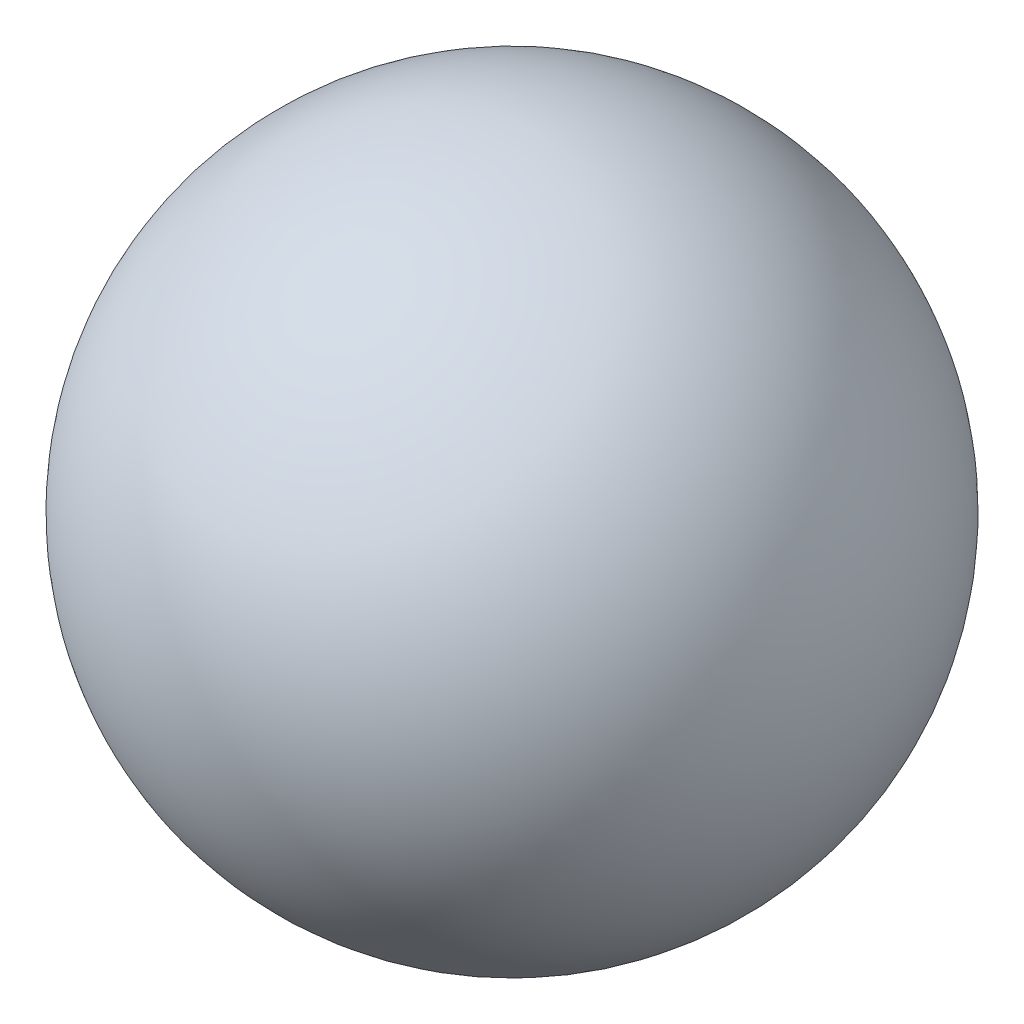
ISO-10303-21;
HEADER;
FILE_DESCRIPTION(('STEP AP214'),'2;1');
FILE_NAME('part.step','',(''),(''),'','','');
FILE_SCHEMA(('AUTOMOTIVE_DESIGN { 1 0 10303 214 1 1 1 1 }'));
ENDSEC;
DATA;
#1=APPLICATION_CONTEXT('core data for automotive mechanical design processes');
#2=APPLICATION_PROTOCOL_DEFINITION('international standard','automotive_design',2000,#1);
#3=PRODUCT_CONTEXT('',#1,'mechanical');
#4=PRODUCT('Part','Part','',(#3));
#5=PRODUCT_RELATED_PRODUCT_CATEGORY('part','',(#4));
#6=PRODUCT_DEFINITION_FORMATION('','',#4);
#7=PRODUCT_DEFINITION_CONTEXT('part definition',#1,'design');
#8=PRODUCT_DEFINITION('design','',#6,#7);
#9=PRODUCT_DEFINITION_SHAPE('','',#8);
#10=(LENGTH_UNIT() NAMED_UNIT(*) SI_UNIT(.MILLI.,.METRE.));
#11=(NAMED_UNIT(*) PLANE_ANGLE_UNIT() SI_UNIT($,.RADIAN.));
#12=(NAMED_UNIT(*) SI_UNIT($,.STERADIAN.) SOLID_ANGLE_UNIT());
#13=UNCERTAINTY_MEASURE_WITH_UNIT(LENGTH_MEASURE(1.E-05),#10,'distance_accuracy_value','');
#14=(GEOMETRIC_REPRESENTATION_CONTEXT(3) GLOBAL_UNCERTAINTY_ASSIGNED_CONTEXT((#13)) GLOBAL_UNIT_ASSIGNED_CONTEXT((#10,
#11,#12)) REPRESENTATION_CONTEXT('',''));
#15=CARTESIAN_POINT('',(0.,0.,0.));
#16=DIRECTION('',(0.,0.,1.));
#17=DIRECTION('',(1.,0.,0.));
#18=AXIS2_PLACEMENT_3D('',#15,#16,#17);
#19=CARTESIAN_POINT('',(0.,0.,0.));
#20=DIRECTION('',(0.,0.,1.));
#21=DIRECTION('',(1.,0.,0.));
#22=AXIS2_PLACEMENT_3D('',#19,#20,#21);
#23=SPHERICAL_SURFACE('',#22,260.);
#24=CARTESIAN_POINT('',(0.,0.,260.));
#25=VERTEX_POINT('',#24);
#26=VERTEX_LOOP('',#25);
#27=FACE_BOUND('',#26,.T.);
#28=ADVANCED_FACE('F35',(#27),#23,.T.);
#29=CLOSED_SHELL('',(#28));
#30=CARTESIAN_POINT('',(0.,0.,0.));
#31=DIRECTION('',(0.,0.,1.));
#32=DIRECTION('',(1.,0.,0.));
#33=AXIS2_PLACEMENT_3D('',#30,#31,#32);
#34=SPHERICAL_SURFACE('',#33,140.);
#35=CARTESIAN_POINT('',(0.,0.,140.));
#36=VERTEX_POINT('',#35);
#37=VERTEX_LOOP('',#36);
#38=FACE_BOUND('',#37,.T.);
#39=ADVANCED_FACE('F49',(#38),#34,.F.);
#40=CLOSED_SHELL('',(#39));
#41=ORIENTED_CLOSED_SHELL('',*,#40,.T.);
#42=BREP_WITH_VOIDS('B2',#29,(#41));
#43=ADVANCED_BREP_SHAPE_REPRESENTATION('',(#18,#42),#14);
#44=SHAPE_DEFINITION_REPRESENTATION(#9,#43);
ENDSEC;
END-ISO-10303-21;
